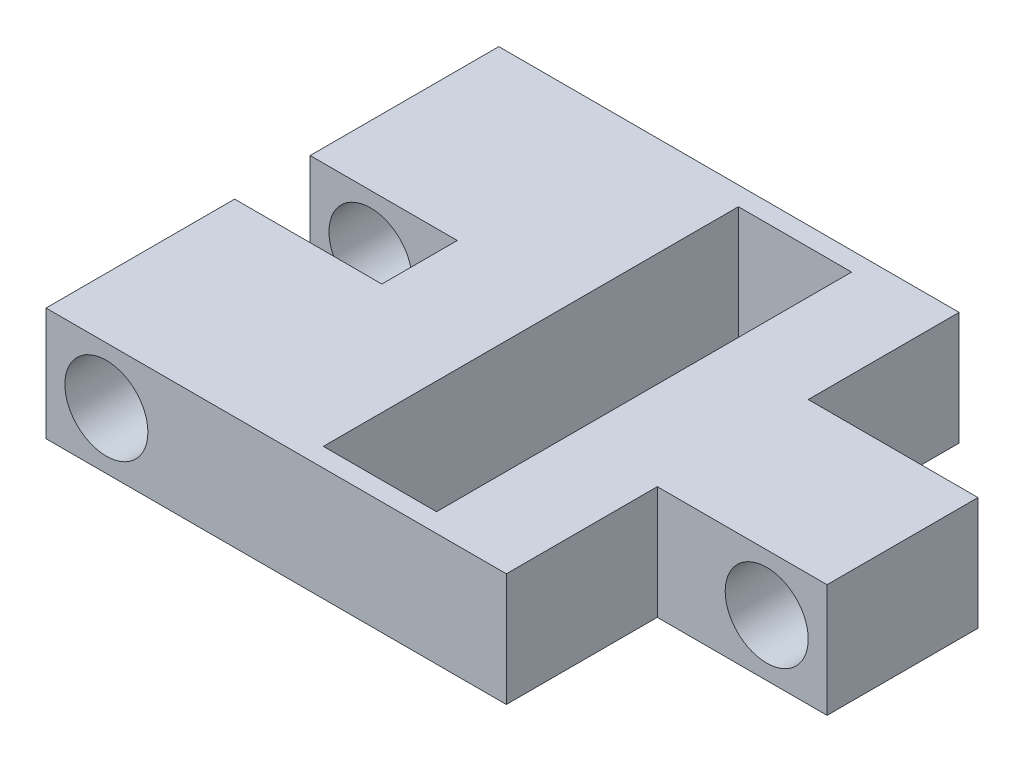
ISO-10303-21;
HEADER;
FILE_DESCRIPTION(('STEP AP214'),'2;1');
FILE_NAME('part.step','',(''),(''),'','','');
FILE_SCHEMA(('AUTOMOTIVE_DESIGN { 1 0 10303 214 1 1 1 1 }'));
ENDSEC;
DATA;
#1=APPLICATION_CONTEXT('core data for automotive mechanical design processes');
#2=APPLICATION_PROTOCOL_DEFINITION('international standard','automotive_design',2000,#1);
#3=PRODUCT_CONTEXT('',#1,'mechanical');
#4=PRODUCT('Part','Part','',(#3));
#5=PRODUCT_RELATED_PRODUCT_CATEGORY('part','',(#4));
#6=PRODUCT_DEFINITION_FORMATION('','',#4);
#7=PRODUCT_DEFINITION_CONTEXT('part definition',#1,'design');
#8=PRODUCT_DEFINITION('design','',#6,#7);
#9=PRODUCT_DEFINITION_SHAPE('','',#8);
#10=(LENGTH_UNIT() NAMED_UNIT(*) SI_UNIT(.MILLI.,.METRE.));
#11=(NAMED_UNIT(*) PLANE_ANGLE_UNIT() SI_UNIT($,.RADIAN.));
#12=(NAMED_UNIT(*) SI_UNIT($,.STERADIAN.) SOLID_ANGLE_UNIT());
#13=UNCERTAINTY_MEASURE_WITH_UNIT(LENGTH_MEASURE(1.E-05),#10,'distance_accuracy_value','');
#14=(GEOMETRIC_REPRESENTATION_CONTEXT(3) GLOBAL_UNCERTAINTY_ASSIGNED_CONTEXT((#13)) GLOBAL_UNIT_ASSIGNED_CONTEXT((#10,
#11,#12)) REPRESENTATION_CONTEXT('',''));
#15=CARTESIAN_POINT('',(0.,0.,0.));
#16=DIRECTION('',(0.,0.,1.));
#17=DIRECTION('',(1.,0.,0.));
#18=AXIS2_PLACEMENT_3D('',#15,#16,#17);
#19=CARTESIAN_POINT('',(-6.75,0.,-6.));
#20=DIRECTION('',(0.,0.,1.));
#21=DIRECTION('',(1.,0.,0.));
#22=AXIS2_PLACEMENT_3D('',#19,#20,#21);
#23=CYLINDRICAL_SURFACE('',#22,1.1);
#24=CARTESIAN_POINT('',(-6.75,0.,-1.));
#25=DIRECTION('',(0.,0.,-1.));
#26=DIRECTION('',(-1.,0.,0.));
#27=AXIS2_PLACEMENT_3D('',#24,#25,#26);
#28=CIRCLE('',#27,1.1);
#29=CARTESIAN_POINT('',(-7.85,0.,-1.));
#30=VERTEX_POINT('',#29);
#31=EDGE_CURVE('E219',#30,#30,#28,.F.);
#32=ORIENTED_EDGE('',*,*,#31,.T.);
#33=EDGE_LOOP('',(#32));
#34=FACE_BOUND('',#33,.T.);
#35=CARTESIAN_POINT('',(-6.75,0.,-6.));
#36=DIRECTION('',(0.,0.,1.));
#37=DIRECTION('',(1.,0.,0.));
#38=AXIS2_PLACEMENT_3D('',#35,#36,#37);
#39=CIRCLE('',#38,1.1);
#40=CARTESIAN_POINT('',(-5.65,0.,-6.));
#41=VERTEX_POINT('',#40);
#42=EDGE_CURVE('E251',#41,#41,#39,.T.);
#43=ORIENTED_EDGE('',*,*,#42,.F.);
#44=EDGE_LOOP('',(#43));
#45=FACE_BOUND('',#44,.T.);
#46=ADVANCED_FACE('F33',(#34,#45),#23,.F.);
#47=CARTESIAN_POINT('',(0.,0.,-6.));
#48=DIRECTION('',(0.,0.,-1.));
#49=DIRECTION('',(-1.,0.,0.));
#50=AXIS2_PLACEMENT_3D('',#47,#48,#49);
#51=PLANE('',#50);
#52=DIRECTION('',(0.,1.,0.));
#53=VECTOR('',#52,1.);
#54=CARTESIAN_POINT('',(3.85,0.,-6.));
#55=LINE('',#54,#53);
#56=CARTESIAN_POINT('',(3.85,-1.5,-6.));
#57=VERTEX_POINT('',#56);
#58=CARTESIAN_POINT('',(3.85,1.5,-6.));
#59=VERTEX_POINT('',#58);
#60=EDGE_CURVE('E11',#57,#59,#55,.T.);
#61=ORIENTED_EDGE('',*,*,#60,.F.);
#62=DIRECTION('',(1.,0.,0.));
#63=VECTOR('',#62,1.);
#64=CARTESIAN_POINT('',(-8.35,-1.5,-6.));
#65=LINE('',#64,#63);
#66=CARTESIAN_POINT('',(-8.35,-1.5,-6.));
#67=VERTEX_POINT('',#66);
#68=EDGE_CURVE('E259',#67,#57,#65,.T.);
#69=ORIENTED_EDGE('',*,*,#68,.F.);
#70=DIRECTION('',(0.,-1.,0.));
#71=VECTOR('',#70,1.);
#72=CARTESIAN_POINT('',(-8.35,-1.5,-6.));
#73=LINE('',#72,#71);
#74=CARTESIAN_POINT('',(-8.35,1.5,-6.));
#75=VERTEX_POINT('',#74);
#76=EDGE_CURVE('E256',#75,#67,#73,.T.);
#77=ORIENTED_EDGE('',*,*,#76,.F.);
#78=DIRECTION('',(-1.,0.,0.));
#79=VECTOR('',#78,1.);
#80=CARTESIAN_POINT('',(-8.35,1.5,-6.));
#81=LINE('',#80,#79);
#82=EDGE_CURVE('E254',#59,#75,#81,.T.);
#83=ORIENTED_EDGE('',*,*,#82,.F.);
#84=EDGE_LOOP('',(#61,#69,#77,#83));
#85=FACE_BOUND('',#84,.T.);
#86=ORIENTED_EDGE('',*,*,#42,.T.);
#87=EDGE_LOOP('',(#86));
#88=FACE_BOUND('',#87,.T.);
#89=ADVANCED_FACE('F304',(#85,#88),#51,.T.);
#90=CARTESIAN_POINT('',(0.,0.,6.));
#91=DIRECTION('',(0.,0.,-1.));
#92=DIRECTION('',(-1.,0.,0.));
#93=AXIS2_PLACEMENT_3D('',#90,#91,#92);
#94=PLANE('',#93);
#95=DIRECTION('',(1.,0.,0.));
#96=VECTOR('',#95,1.);
#97=CARTESIAN_POINT('',(-8.35,-1.5,6.));
#98=LINE('',#97,#96);
#99=CARTESIAN_POINT('',(-8.35,-1.5,6.));
#100=VERTEX_POINT('',#99);
#101=CARTESIAN_POINT('',(3.85000000000001,-1.5,6.));
#102=VERTEX_POINT('',#101);
#103=EDGE_CURVE('E248',#100,#102,#98,.T.);
#104=ORIENTED_EDGE('',*,*,#103,.T.);
#105=DIRECTION('',(0.,1.,0.));
#106=VECTOR('',#105,1.);
#107=CARTESIAN_POINT('',(3.85,0.,6.));
#108=LINE('',#107,#106);
#109=CARTESIAN_POINT('',(3.85,1.5,6.));
#110=VERTEX_POINT('',#109);
#111=EDGE_CURVE('E41',#102,#110,#108,.T.);
#112=ORIENTED_EDGE('',*,*,#111,.T.);
#113=DIRECTION('',(-1.,0.,0.));
#114=VECTOR('',#113,1.);
#115=CARTESIAN_POINT('',(-8.35,1.5,6.));
#116=LINE('',#115,#114);
#117=CARTESIAN_POINT('',(-8.35,1.5,6.));
#118=VERTEX_POINT('',#117);
#119=EDGE_CURVE('E172',#110,#118,#116,.T.);
#120=ORIENTED_EDGE('',*,*,#119,.T.);
#121=DIRECTION('',(0.,-1.,0.));
#122=VECTOR('',#121,1.);
#123=CARTESIAN_POINT('',(-8.35,-1.5,6.));
#124=LINE('',#123,#122);
#125=EDGE_CURVE('E245',#118,#100,#124,.T.);
#126=ORIENTED_EDGE('',*,*,#125,.T.);
#127=EDGE_LOOP('',(#104,#112,#120,#126));
#128=FACE_BOUND('',#127,.T.);
#129=CARTESIAN_POINT('',(-6.75,0.,6.));
#130=DIRECTION('',(0.,0.,1.));
#131=DIRECTION('',(1.,0.,0.));
#132=AXIS2_PLACEMENT_3D('',#129,#130,#131);
#133=CIRCLE('',#132,1.1);
#134=CARTESIAN_POINT('',(-5.65,0.,6.));
#135=VERTEX_POINT('',#134);
#136=EDGE_CURVE('E241',#135,#135,#133,.T.);
#137=ORIENTED_EDGE('',*,*,#136,.F.);
#138=EDGE_LOOP('',(#137));
#139=FACE_BOUND('',#138,.T.);
#140=ADVANCED_FACE('F310',(#128,#139),#94,.F.);
#141=CARTESIAN_POINT('',(-6.75,0.,1.));
#142=DIRECTION('',(0.,0.,1.));
#143=DIRECTION('',(1.,0.,0.));
#144=AXIS2_PLACEMENT_3D('',#141,#142,#143);
#145=CIRCLE('',#144,1.1);
#146=CARTESIAN_POINT('',(-5.65,0.,1.));
#147=VERTEX_POINT('',#146);
#148=EDGE_CURVE('E224',#147,#147,#145,.F.);
#149=ORIENTED_EDGE('',*,*,#148,.T.);
#150=EDGE_LOOP('',(#149));
#151=FACE_BOUND('',#150,.T.);
#152=ORIENTED_EDGE('',*,*,#136,.T.);
#153=EDGE_LOOP('',(#152));
#154=FACE_BOUND('',#153,.T.);
#155=ADVANCED_FACE('F284',(#151,#154),#23,.F.);
#156=CARTESIAN_POINT('',(-8.35,1.5,-6.));
#157=DIRECTION('',(0.,1.,0.));
#158=DIRECTION('',(-1.,0.,0.));
#159=AXIS2_PLACEMENT_3D('',#156,#157,#158);
#160=PLANE('',#159);
#161=DIRECTION('',(1.,0.,0.));
#162=VECTOR('',#161,1.);
#163=CARTESIAN_POINT('',(-12.2499999999999,1.5,1.));
#164=LINE('',#163,#162);
#165=CARTESIAN_POINT('',(-8.35,1.5,1.));
#166=VERTEX_POINT('',#165);
#167=CARTESIAN_POINT('',(-4.44999999999993,1.5,1.));
#168=VERTEX_POINT('',#167);
#169=EDGE_CURVE('E186',#166,#168,#164,.T.);
#170=ORIENTED_EDGE('',*,*,#169,.F.);
#171=DIRECTION('',(0.,0.,1.));
#172=VECTOR('',#171,1.);
#173=CARTESIAN_POINT('',(-8.35,1.5,-6.));
#174=LINE('',#173,#172);
#175=EDGE_CURVE('E273',#166,#118,#174,.T.);
#176=ORIENTED_EDGE('',*,*,#175,.T.);
#177=ORIENTED_EDGE('',*,*,#119,.F.);
#178=DIRECTION('',(0.,0.,1.));
#179=VECTOR('',#178,1.);
#180=CARTESIAN_POINT('',(3.85,1.5,10.));
#181=LINE('',#180,#179);
#182=CARTESIAN_POINT('',(3.85,1.5,2.));
#183=VERTEX_POINT('',#182);
#184=EDGE_CURVE('E149',#183,#110,#181,.T.);
#185=ORIENTED_EDGE('',*,*,#184,.F.);
#186=DIRECTION('',(-1.,0.,0.));
#187=VECTOR('',#186,1.);
#188=CARTESIAN_POINT('',(12.85,1.5,2.));
#189=LINE('',#188,#187);
#190=CARTESIAN_POINT('',(8.35,1.5,2.));
#191=VERTEX_POINT('',#190);
#192=EDGE_CURVE('E156',#191,#183,#189,.T.);
#193=ORIENTED_EDGE('',*,*,#192,.F.);
#194=DIRECTION('',(0.,0.,1.));
#195=VECTOR('',#194,1.);
#196=CARTESIAN_POINT('',(8.35,1.5,-6.));
#197=LINE('',#196,#195);
#198=CARTESIAN_POINT('',(8.35,1.5,-2.));
#199=VERTEX_POINT('',#198);
#200=EDGE_CURVE('E262',#199,#191,#197,.T.);
#201=ORIENTED_EDGE('',*,*,#200,.F.);
#202=DIRECTION('',(1.,0.,0.));
#203=VECTOR('',#202,1.);
#204=CARTESIAN_POINT('',(12.85,1.5,-2.));
#205=LINE('',#204,#203);
#206=CARTESIAN_POINT('',(3.85,1.5,-2.));
#207=VERTEX_POINT('',#206);
#208=EDGE_CURVE('E176',#207,#199,#205,.T.);
#209=ORIENTED_EDGE('',*,*,#208,.F.);
#210=DIRECTION('',(0.,0.,1.));
#211=VECTOR('',#210,1.);
#212=CARTESIAN_POINT('',(3.85,1.5,-10.));
#213=LINE('',#212,#211);
#214=EDGE_CURVE('E179',#59,#207,#213,.T.);
#215=ORIENTED_EDGE('',*,*,#214,.F.);
#216=ORIENTED_EDGE('',*,*,#82,.T.);
#217=CARTESIAN_POINT('',(-8.35,1.5,-1.));
#218=VERTEX_POINT('',#217);
#219=EDGE_CURVE('E270',#75,#218,#174,.T.);
#220=ORIENTED_EDGE('',*,*,#219,.T.);
#221=DIRECTION('',(-1.,0.,0.));
#222=VECTOR('',#221,1.);
#223=CARTESIAN_POINT('',(-12.2499999999999,1.5,-1.));
#224=LINE('',#223,#222);
#225=CARTESIAN_POINT('',(-4.44999999999993,1.5,-1.));
#226=VERTEX_POINT('',#225);
#227=EDGE_CURVE('E184',#226,#218,#224,.T.);
#228=ORIENTED_EDGE('',*,*,#227,.F.);
#229=DIRECTION('',(0.,0.,-1.));
#230=VECTOR('',#229,1.);
#231=CARTESIAN_POINT('',(-4.44999999999993,1.5,1.));
#232=LINE('',#231,#230);
#233=EDGE_CURVE('E56',#168,#226,#232,.T.);
#234=ORIENTED_EDGE('',*,*,#233,.F.);
#235=EDGE_LOOP('',(#170,#176,#177,#185,#193,#201,#209,#215,#216,#220,#228,#234));
#236=FACE_BOUND('',#235,.T.);
#237=DIRECTION('',(0.,0.,-1.));
#238=VECTOR('',#237,1.);
#239=CARTESIAN_POINT('',(1.5,1.5,5.5));
#240=LINE('',#239,#238);
#241=CARTESIAN_POINT('',(1.5,1.5,5.5));
#242=VERTEX_POINT('',#241);
#243=CARTESIAN_POINT('',(1.5,1.5,-5.5));
#244=VERTEX_POINT('',#243);
#245=EDGE_CURVE('E155',#242,#244,#240,.T.);
#246=ORIENTED_EDGE('',*,*,#245,.F.);
#247=DIRECTION('',(1.,0.,0.));
#248=VECTOR('',#247,1.);
#249=CARTESIAN_POINT('',(-1.5,1.5,5.5));
#250=LINE('',#249,#248);
#251=CARTESIAN_POINT('',(-1.5,1.5,5.5));
#252=VERTEX_POINT('',#251);
#253=EDGE_CURVE('E198',#252,#242,#250,.T.);
#254=ORIENTED_EDGE('',*,*,#253,.F.);
#255=DIRECTION('',(0.,0.,1.));
#256=VECTOR('',#255,1.);
#257=CARTESIAN_POINT('',(-1.5,1.5,5.5));
#258=LINE('',#257,#256);
#259=CARTESIAN_POINT('',(-1.5,1.5,-5.5));
#260=VERTEX_POINT('',#259);
#261=EDGE_CURVE('E195',#260,#252,#258,.T.);
#262=ORIENTED_EDGE('',*,*,#261,.F.);
#263=DIRECTION('',(-1.,0.,0.));
#264=VECTOR('',#263,1.);
#265=CARTESIAN_POINT('',(-1.5,1.5,-5.5));
#266=LINE('',#265,#264);
#267=EDGE_CURVE('E193',#244,#260,#266,.T.);
#268=ORIENTED_EDGE('',*,*,#267,.F.);
#269=EDGE_LOOP('',(#246,#254,#262,#268));
#270=FACE_BOUND('',#269,.T.);
#271=ADVANCED_FACE('F169',(#236,#270),#160,.T.);
#272=CARTESIAN_POINT('',(-8.35,-1.5,-6.));
#273=DIRECTION('',(-1.,0.,0.));
#274=DIRECTION('',(0.,0.,1.));
#275=AXIS2_PLACEMENT_3D('',#272,#273,#274);
#276=PLANE('',#275);
#277=DIRECTION('',(0.,-1.,0.));
#278=VECTOR('',#277,1.);
#279=CARTESIAN_POINT('',(-8.35,-1.5,-1.));
#280=LINE('',#279,#278);
#281=CARTESIAN_POINT('',(-8.35,-1.5,-1.));
#282=VERTEX_POINT('',#281);
#283=EDGE_CURVE('E220',#218,#282,#280,.T.);
#284=ORIENTED_EDGE('',*,*,#283,.F.);
#285=ORIENTED_EDGE('',*,*,#219,.F.);
#286=ORIENTED_EDGE('',*,*,#76,.T.);
#287=DIRECTION('',(0.,0.,1.));
#288=VECTOR('',#287,1.);
#289=CARTESIAN_POINT('',(-8.35,-1.5,-6.));
#290=LINE('',#289,#288);
#291=EDGE_CURVE('E266',#67,#282,#290,.T.);
#292=ORIENTED_EDGE('',*,*,#291,.T.);
#293=EDGE_LOOP('',(#284,#285,#286,#292));
#294=FACE_BOUND('',#293,.T.);
#295=ADVANCED_FACE('F320',(#294),#276,.T.);
#296=DIRECTION('',(0.,1.,0.));
#297=VECTOR('',#296,1.);
#298=CARTESIAN_POINT('',(-8.35,-1.5,1.));
#299=LINE('',#298,#297);
#300=CARTESIAN_POINT('',(-8.35,-1.5,1.));
#301=VERTEX_POINT('',#300);
#302=EDGE_CURVE('E225',#301,#166,#299,.T.);
#303=ORIENTED_EDGE('',*,*,#302,.F.);
#304=EDGE_CURVE('E269',#301,#100,#290,.T.);
#305=ORIENTED_EDGE('',*,*,#304,.T.);
#306=ORIENTED_EDGE('',*,*,#125,.F.);
#307=ORIENTED_EDGE('',*,*,#175,.F.);
#308=EDGE_LOOP('',(#303,#305,#306,#307));
#309=FACE_BOUND('',#308,.T.);
#310=ADVANCED_FACE('F352',(#309),#276,.T.);
#311=CARTESIAN_POINT('',(-8.35,-1.5,-6.));
#312=DIRECTION('',(0.,-1.,0.));
#313=DIRECTION('',(0.,0.,-1.));
#314=AXIS2_PLACEMENT_3D('',#311,#312,#313);
#315=PLANE('',#314);
#316=DIRECTION('',(-1.,0.,0.));
#317=VECTOR('',#316,1.);
#318=CARTESIAN_POINT('',(-8.35,-1.5,1.));
#319=LINE('',#318,#317);
#320=CARTESIAN_POINT('',(-4.44999999999993,-1.5,1.));
#321=VERTEX_POINT('',#320);
#322=EDGE_CURVE('E227',#321,#301,#319,.T.);
#323=ORIENTED_EDGE('',*,*,#322,.F.);
#324=DIRECTION('',(0.,0.,1.));
#325=VECTOR('',#324,1.);
#326=CARTESIAN_POINT('',(-4.44999999999993,-1.5,-6.));
#327=LINE('',#326,#325);
#328=CARTESIAN_POINT('',(-4.44999999999993,-1.5,-1.));
#329=VERTEX_POINT('',#328);
#330=EDGE_CURVE('E239',#329,#321,#327,.T.);
#331=ORIENTED_EDGE('',*,*,#330,.F.);
#332=DIRECTION('',(1.,0.,0.));
#333=VECTOR('',#332,1.);
#334=CARTESIAN_POINT('',(-8.35,-1.5,-1.));
#335=LINE('',#334,#333);
#336=EDGE_CURVE('E222',#282,#329,#335,.T.);
#337=ORIENTED_EDGE('',*,*,#336,.F.);
#338=ORIENTED_EDGE('',*,*,#291,.F.);
#339=ORIENTED_EDGE('',*,*,#68,.T.);
#340=DIRECTION('',(0.,0.,-1.));
#341=VECTOR('',#340,1.);
#342=CARTESIAN_POINT('',(3.85000000000001,-1.5,-6.));
#343=LINE('',#342,#341);
#344=CARTESIAN_POINT('',(3.85,-1.5,-2.));
#345=VERTEX_POINT('',#344);
#346=EDGE_CURVE('E229',#345,#57,#343,.T.);
#347=ORIENTED_EDGE('',*,*,#346,.F.);
#348=DIRECTION('',(-1.,0.,0.));
#349=VECTOR('',#348,1.);
#350=CARTESIAN_POINT('',(-8.35,-1.5,-2.));
#351=LINE('',#350,#349);
#352=CARTESIAN_POINT('',(8.35,-1.5,-2.));
#353=VERTEX_POINT('',#352);
#354=EDGE_CURVE('E215',#353,#345,#351,.T.);
#355=ORIENTED_EDGE('',*,*,#354,.F.);
#356=DIRECTION('',(0.,0.,1.));
#357=VECTOR('',#356,1.);
#358=CARTESIAN_POINT('',(8.35,-1.5,-6.));
#359=LINE('',#358,#357);
#360=CARTESIAN_POINT('',(8.35,-1.5,2.));
#361=VERTEX_POINT('',#360);
#362=EDGE_CURVE('E263',#353,#361,#359,.T.);
#363=ORIENTED_EDGE('',*,*,#362,.T.);
#364=DIRECTION('',(1.,0.,0.));
#365=VECTOR('',#364,1.);
#366=CARTESIAN_POINT('',(-8.35,-1.5,2.));
#367=LINE('',#366,#365);
#368=CARTESIAN_POINT('',(3.85000000000001,-1.5,2.));
#369=VERTEX_POINT('',#368);
#370=EDGE_CURVE('E211',#369,#361,#367,.T.);
#371=ORIENTED_EDGE('',*,*,#370,.F.);
#372=DIRECTION('',(0.,0.,-1.));
#373=VECTOR('',#372,1.);
#374=CARTESIAN_POINT('',(3.85000000000001,-1.5,-6.));
#375=LINE('',#374,#373);
#376=EDGE_CURVE('E152',#102,#369,#375,.T.);
#377=ORIENTED_EDGE('',*,*,#376,.F.);
#378=ORIENTED_EDGE('',*,*,#103,.F.);
#379=ORIENTED_EDGE('',*,*,#304,.F.);
#380=EDGE_LOOP('',(#323,#331,#337,#338,#339,#347,#355,#363,#371,#377,#378,#379));
#381=FACE_BOUND('',#380,.T.);
#382=DIRECTION('',(0.,0.,1.));
#383=VECTOR('',#382,1.);
#384=CARTESIAN_POINT('',(1.5,-1.5,-6.));
#385=LINE('',#384,#383);
#386=CARTESIAN_POINT('',(1.5,-1.5,-5.5));
#387=VERTEX_POINT('',#386);
#388=CARTESIAN_POINT('',(1.5,-1.5,5.5));
#389=VERTEX_POINT('',#388);
#390=EDGE_CURVE('E237',#387,#389,#385,.T.);
#391=ORIENTED_EDGE('',*,*,#390,.F.);
#392=DIRECTION('',(1.,0.,0.));
#393=VECTOR('',#392,1.);
#394=CARTESIAN_POINT('',(-8.35,-1.5,-5.5));
#395=LINE('',#394,#393);
#396=CARTESIAN_POINT('',(-1.5,-1.5,-5.5));
#397=VERTEX_POINT('',#396);
#398=EDGE_CURVE('E231',#397,#387,#395,.T.);
#399=ORIENTED_EDGE('',*,*,#398,.F.);
#400=DIRECTION('',(0.,0.,-1.));
#401=VECTOR('',#400,1.);
#402=CARTESIAN_POINT('',(-1.5,-1.5,-6.));
#403=LINE('',#402,#401);
#404=CARTESIAN_POINT('',(-1.5,-1.5,5.5));
#405=VERTEX_POINT('',#404);
#406=EDGE_CURVE('E233',#405,#397,#403,.T.);
#407=ORIENTED_EDGE('',*,*,#406,.F.);
#408=DIRECTION('',(-1.,0.,0.));
#409=VECTOR('',#408,1.);
#410=CARTESIAN_POINT('',(-8.35,-1.5,5.5));
#411=LINE('',#410,#409);
#412=EDGE_CURVE('E235',#389,#405,#411,.T.);
#413=ORIENTED_EDGE('',*,*,#412,.F.);
#414=EDGE_LOOP('',(#391,#399,#407,#413));
#415=FACE_BOUND('',#414,.T.);
#416=ADVANCED_FACE('F347',(#381,#415),#315,.T.);
#417=CARTESIAN_POINT('',(8.35,-1.5,-6.));
#418=DIRECTION('',(1.,0.,0.));
#419=DIRECTION('',(0.,0.,-1.));
#420=AXIS2_PLACEMENT_3D('',#417,#418,#419);
#421=PLANE('',#420);
#422=DIRECTION('',(0.,-1.,0.));
#423=VECTOR('',#422,1.);
#424=CARTESIAN_POINT('',(8.35,-1.5,-2.));
#425=LINE('',#424,#423);
#426=EDGE_CURVE('E217',#199,#353,#425,.T.);
#427=ORIENTED_EDGE('',*,*,#426,.F.);
#428=ORIENTED_EDGE('',*,*,#200,.T.);
#429=DIRECTION('',(0.,1.,0.));
#430=VECTOR('',#429,1.);
#431=CARTESIAN_POINT('',(8.35,-1.5,2.));
#432=LINE('',#431,#430);
#433=EDGE_CURVE('E162',#361,#191,#432,.T.);
#434=ORIENTED_EDGE('',*,*,#433,.F.);
#435=ORIENTED_EDGE('',*,*,#362,.F.);
#436=EDGE_LOOP('',(#427,#428,#434,#435));
#437=FACE_BOUND('',#436,.T.);
#438=ADVANCED_FACE('F35',(#437),#421,.T.);
#439=CARTESIAN_POINT('',(12.85,-3.5,2.));
#440=DIRECTION('',(0.,0.,-1.));
#441=DIRECTION('',(-1.,0.,0.));
#442=AXIS2_PLACEMENT_3D('',#439,#440,#441);
#443=PLANE('',#442);
#444=ORIENTED_EDGE('',*,*,#433,.T.);
#445=ORIENTED_EDGE('',*,*,#192,.T.);
#446=DIRECTION('',(0.,1.,0.));
#447=VECTOR('',#446,1.);
#448=CARTESIAN_POINT('',(3.85000000000001,-3.5,2.));
#449=LINE('',#448,#447);
#450=EDGE_CURVE('E145',#369,#183,#449,.T.);
#451=ORIENTED_EDGE('',*,*,#450,.F.);
#452=ORIENTED_EDGE('',*,*,#370,.T.);
#453=EDGE_LOOP('',(#444,#445,#451,#452));
#454=FACE_BOUND('',#453,.T.);
#455=CARTESIAN_POINT('',(6.75,0.,2.));
#456=DIRECTION('',(0.,0.,-1.));
#457=DIRECTION('',(-1.,0.,0.));
#458=AXIS2_PLACEMENT_3D('',#455,#456,#457);
#459=CIRCLE('',#458,1.1);
#460=CARTESIAN_POINT('',(5.65,0.,2.));
#461=VERTEX_POINT('',#460);
#462=EDGE_CURVE('E210',#461,#461,#459,.F.);
#463=ORIENTED_EDGE('',*,*,#462,.F.);
#464=EDGE_LOOP('',(#463));
#465=FACE_BOUND('',#464,.T.);
#466=ADVANCED_FACE('F159',(#454,#465),#443,.F.);
#467=CARTESIAN_POINT('',(3.85000000000001,-3.5,10.));
#468=DIRECTION('',(-1.,0.,0.));
#469=DIRECTION('',(0.,-1.,0.));
#470=AXIS2_PLACEMENT_3D('',#467,#468,#469);
#471=PLANE('',#470);
#472=ORIENTED_EDGE('',*,*,#376,.T.);
#473=ORIENTED_EDGE('',*,*,#450,.T.);
#474=ORIENTED_EDGE('',*,*,#184,.T.);
#475=ORIENTED_EDGE('',*,*,#111,.F.);
#476=EDGE_LOOP('',(#472,#473,#474,#475));
#477=FACE_BOUND('',#476,.T.);
#478=ADVANCED_FACE('F147',(#477),#471,.F.);
#479=CARTESIAN_POINT('',(6.75,0.,-6.));
#480=DIRECTION('',(0.,0.,1.));
#481=DIRECTION('',(1.,0.,0.));
#482=AXIS2_PLACEMENT_3D('',#479,#480,#481);
#483=CYLINDRICAL_SURFACE('',#482,1.1);
#484=CARTESIAN_POINT('',(6.75,0.,-2.));
#485=DIRECTION('',(0.,0.,1.));
#486=DIRECTION('',(1.,0.,0.));
#487=AXIS2_PLACEMENT_3D('',#484,#485,#486);
#488=CIRCLE('',#487,1.1);
#489=CARTESIAN_POINT('',(7.85,0.,-2.));
#490=VERTEX_POINT('',#489);
#491=EDGE_CURVE('E214',#490,#490,#488,.F.);
#492=ORIENTED_EDGE('',*,*,#491,.T.);
#493=EDGE_LOOP('',(#492));
#494=FACE_BOUND('',#493,.T.);
#495=ORIENTED_EDGE('',*,*,#462,.T.);
#496=EDGE_LOOP('',(#495));
#497=FACE_BOUND('',#496,.T.);
#498=ADVANCED_FACE('F329',(#494,#497),#483,.F.);
#499=CARTESIAN_POINT('',(12.85,-3.5,-2.));
#500=DIRECTION('',(0.,0.,1.));
#501=DIRECTION('',(1.,0.,0.));
#502=AXIS2_PLACEMENT_3D('',#499,#500,#501);
#503=PLANE('',#502);
#504=ORIENTED_EDGE('',*,*,#426,.T.);
#505=ORIENTED_EDGE('',*,*,#354,.T.);
#506=DIRECTION('',(0.,1.,0.));
#507=VECTOR('',#506,1.);
#508=CARTESIAN_POINT('',(3.85000000000001,-3.5,-2.));
#509=LINE('',#508,#507);
#510=EDGE_CURVE('E173',#345,#207,#509,.T.);
#511=ORIENTED_EDGE('',*,*,#510,.T.);
#512=ORIENTED_EDGE('',*,*,#208,.T.);
#513=EDGE_LOOP('',(#504,#505,#511,#512));
#514=FACE_BOUND('',#513,.T.);
#515=ORIENTED_EDGE('',*,*,#491,.F.);
#516=EDGE_LOOP('',(#515));
#517=FACE_BOUND('',#516,.T.);
#518=ADVANCED_FACE('F300',(#514,#517),#503,.F.);
#519=CARTESIAN_POINT('',(3.85000000000001,-3.5,-10.));
#520=DIRECTION('',(-1.,0.,0.));
#521=DIRECTION('',(0.,-1.,0.));
#522=AXIS2_PLACEMENT_3D('',#519,#520,#521);
#523=PLANE('',#522);
#524=ORIENTED_EDGE('',*,*,#346,.T.);
#525=ORIENTED_EDGE('',*,*,#60,.T.);
#526=ORIENTED_EDGE('',*,*,#214,.T.);
#527=ORIENTED_EDGE('',*,*,#510,.F.);
#528=EDGE_LOOP('',(#524,#525,#526,#527));
#529=FACE_BOUND('',#528,.T.);
#530=ADVANCED_FACE('F290',(#529),#523,.F.);
#531=CARTESIAN_POINT('',(-12.2499999999999,-3.5,1.));
#532=DIRECTION('',(0.,0.,1.));
#533=DIRECTION('',(1.,0.,0.));
#534=AXIS2_PLACEMENT_3D('',#531,#532,#533);
#535=PLANE('',#534);
#536=ORIENTED_EDGE('',*,*,#322,.T.);
#537=ORIENTED_EDGE('',*,*,#302,.T.);
#538=ORIENTED_EDGE('',*,*,#169,.T.);
#539=DIRECTION('',(0.,1.,0.));
#540=VECTOR('',#539,1.);
#541=CARTESIAN_POINT('',(-4.44999999999993,-3.5,1.));
#542=LINE('',#541,#540);
#543=EDGE_CURVE('E181',#321,#168,#542,.T.);
#544=ORIENTED_EDGE('',*,*,#543,.F.);
#545=EDGE_LOOP('',(#536,#537,#538,#544));
#546=FACE_BOUND('',#545,.T.);
#547=ORIENTED_EDGE('',*,*,#148,.F.);
#548=EDGE_LOOP('',(#547));
#549=FACE_BOUND('',#548,.T.);
#550=ADVANCED_FACE('F287',(#546,#549),#535,.F.);
#551=CARTESIAN_POINT('',(-12.2499999999999,-3.5,-1.));
#552=DIRECTION('',(0.,0.,-1.));
#553=DIRECTION('',(-1.,0.,0.));
#554=AXIS2_PLACEMENT_3D('',#551,#552,#553);
#555=PLANE('',#554);
#556=ORIENTED_EDGE('',*,*,#336,.T.);
#557=DIRECTION('',(0.,1.,0.));
#558=VECTOR('',#557,1.);
#559=CARTESIAN_POINT('',(-4.44999999999993,-3.5,-1.));
#560=LINE('',#559,#558);
#561=EDGE_CURVE('E189',#329,#226,#560,.T.);
#562=ORIENTED_EDGE('',*,*,#561,.T.);
#563=ORIENTED_EDGE('',*,*,#227,.T.);
#564=ORIENTED_EDGE('',*,*,#283,.T.);
#565=EDGE_LOOP('',(#556,#562,#563,#564));
#566=FACE_BOUND('',#565,.T.);
#567=ORIENTED_EDGE('',*,*,#31,.F.);
#568=EDGE_LOOP('',(#567));
#569=FACE_BOUND('',#568,.T.);
#570=ADVANCED_FACE('F289',(#566,#569),#555,.F.);
#571=CARTESIAN_POINT('',(-4.44999999999993,-3.5,1.));
#572=DIRECTION('',(1.,0.,0.));
#573=DIRECTION('',(0.,1.,0.));
#574=AXIS2_PLACEMENT_3D('',#571,#572,#573);
#575=PLANE('',#574);
#576=ORIENTED_EDGE('',*,*,#330,.T.);
#577=ORIENTED_EDGE('',*,*,#543,.T.);
#578=ORIENTED_EDGE('',*,*,#233,.T.);
#579=ORIENTED_EDGE('',*,*,#561,.F.);
#580=EDGE_LOOP('',(#576,#577,#578,#579));
#581=FACE_BOUND('',#580,.T.);
#582=ADVANCED_FACE('F297',(#581),#575,.F.);
#583=CARTESIAN_POINT('',(1.5,-3.5,5.5));
#584=DIRECTION('',(1.,0.,0.));
#585=DIRECTION('',(0.,1.,0.));
#586=AXIS2_PLACEMENT_3D('',#583,#584,#585);
#587=PLANE('',#586);
#588=ORIENTED_EDGE('',*,*,#390,.T.);
#589=DIRECTION('',(0.,1.,0.));
#590=VECTOR('',#589,1.);
#591=CARTESIAN_POINT('',(1.5,-3.5,5.5));
#592=LINE('',#591,#590);
#593=EDGE_CURVE('E202',#389,#242,#592,.T.);
#594=ORIENTED_EDGE('',*,*,#593,.T.);
#595=ORIENTED_EDGE('',*,*,#245,.T.);
#596=DIRECTION('',(0.,1.,0.));
#597=VECTOR('',#596,1.);
#598=CARTESIAN_POINT('',(1.5,-3.5,-5.5));
#599=LINE('',#598,#597);
#600=EDGE_CURVE('E201',#387,#244,#599,.T.);
#601=ORIENTED_EDGE('',*,*,#600,.F.);
#602=EDGE_LOOP('',(#588,#594,#595,#601));
#603=FACE_BOUND('',#602,.T.);
#604=ADVANCED_FACE('F327',(#603),#587,.F.);
#605=CARTESIAN_POINT('',(-1.5,-3.5,5.5));
#606=DIRECTION('',(0.,0.,1.));
#607=DIRECTION('',(1.,0.,0.));
#608=AXIS2_PLACEMENT_3D('',#605,#606,#607);
#609=PLANE('',#608);
#610=ORIENTED_EDGE('',*,*,#412,.T.);
#611=DIRECTION('',(0.,1.,0.));
#612=VECTOR('',#611,1.);
#613=CARTESIAN_POINT('',(-1.5,-3.5,5.5));
#614=LINE('',#613,#612);
#615=EDGE_CURVE('E204',#405,#252,#614,.T.);
#616=ORIENTED_EDGE('',*,*,#615,.T.);
#617=ORIENTED_EDGE('',*,*,#253,.T.);
#618=ORIENTED_EDGE('',*,*,#593,.F.);
#619=EDGE_LOOP('',(#610,#616,#617,#618));
#620=FACE_BOUND('',#619,.T.);
#621=ADVANCED_FACE('F460',(#620),#609,.F.);
#622=CARTESIAN_POINT('',(-1.5,-3.5,5.5));
#623=DIRECTION('',(-1.,0.,0.));
#624=DIRECTION('',(0.,-1.,0.));
#625=AXIS2_PLACEMENT_3D('',#622,#623,#624);
#626=PLANE('',#625);
#627=ORIENTED_EDGE('',*,*,#406,.T.);
#628=DIRECTION('',(0.,1.,0.));
#629=VECTOR('',#628,1.);
#630=CARTESIAN_POINT('',(-1.5,-3.5,-5.5));
#631=LINE('',#630,#629);
#632=EDGE_CURVE('E48',#397,#260,#631,.T.);
#633=ORIENTED_EDGE('',*,*,#632,.T.);
#634=ORIENTED_EDGE('',*,*,#261,.T.);
#635=ORIENTED_EDGE('',*,*,#615,.F.);
#636=EDGE_LOOP('',(#627,#633,#634,#635));
#637=FACE_BOUND('',#636,.T.);
#638=ADVANCED_FACE('F469',(#637),#626,.F.);
#639=CARTESIAN_POINT('',(-1.5,-3.5,-5.5));
#640=DIRECTION('',(0.,0.,-1.));
#641=DIRECTION('',(-1.,0.,0.));
#642=AXIS2_PLACEMENT_3D('',#639,#640,#641);
#643=PLANE('',#642);
#644=ORIENTED_EDGE('',*,*,#398,.T.);
#645=ORIENTED_EDGE('',*,*,#600,.T.);
#646=ORIENTED_EDGE('',*,*,#267,.T.);
#647=ORIENTED_EDGE('',*,*,#632,.F.);
#648=EDGE_LOOP('',(#644,#645,#646,#647));
#649=FACE_BOUND('',#648,.T.);
#650=ADVANCED_FACE('F479',(#649),#643,.F.);
#651=CLOSED_SHELL('',(#46,#89,#140,#155,#271,#295,#310,#416,#438,#466,#478,#498,#518,#530,#550,
#570,#582,#604,#621,#638,#650));
#652=MANIFOLD_SOLID_BREP('B2',#651);
#653=ADVANCED_BREP_SHAPE_REPRESENTATION('',(#18,#652),#14);
#654=SHAPE_DEFINITION_REPRESENTATION(#9,#653);
ENDSEC;
END-ISO-10303-21;
